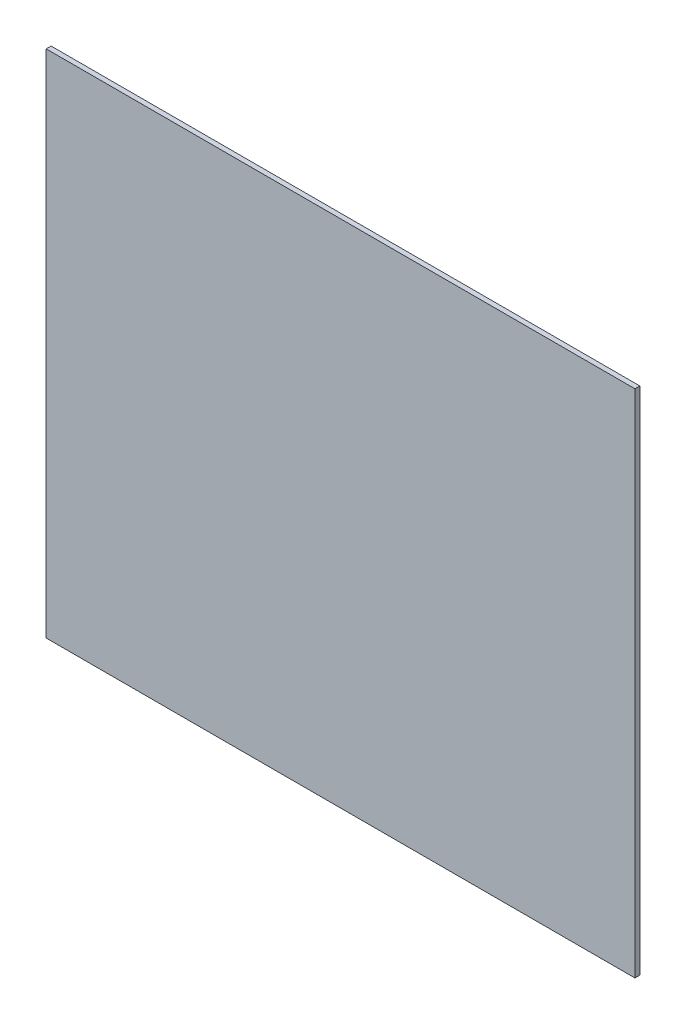
ISO-10303-21;
HEADER;
FILE_DESCRIPTION(('STEP AP214'),'2;1');
FILE_NAME('part.step','',(''),(''),'','','');
FILE_SCHEMA(('AUTOMOTIVE_DESIGN { 1 0 10303 214 1 1 1 1 }'));
ENDSEC;
DATA;
#1=APPLICATION_CONTEXT('core data for automotive mechanical design processes');
#2=APPLICATION_PROTOCOL_DEFINITION('international standard','automotive_design',2000,#1);
#3=PRODUCT_CONTEXT('',#1,'mechanical');
#4=PRODUCT('Part','Part','',(#3));
#5=PRODUCT_RELATED_PRODUCT_CATEGORY('part','',(#4));
#6=PRODUCT_DEFINITION_FORMATION('','',#4);
#7=PRODUCT_DEFINITION_CONTEXT('part definition',#1,'design');
#8=PRODUCT_DEFINITION('design','',#6,#7);
#9=PRODUCT_DEFINITION_SHAPE('','',#8);
#10=(LENGTH_UNIT() NAMED_UNIT(*) SI_UNIT(.MILLI.,.METRE.));
#11=(NAMED_UNIT(*) PLANE_ANGLE_UNIT() SI_UNIT($,.RADIAN.));
#12=(NAMED_UNIT(*) SI_UNIT($,.STERADIAN.) SOLID_ANGLE_UNIT());
#13=UNCERTAINTY_MEASURE_WITH_UNIT(LENGTH_MEASURE(1.E-05),#10,'distance_accuracy_value','');
#14=(GEOMETRIC_REPRESENTATION_CONTEXT(3) GLOBAL_UNCERTAINTY_ASSIGNED_CONTEXT((#13)) GLOBAL_UNIT_ASSIGNED_CONTEXT((#10,
#11,#12)) REPRESENTATION_CONTEXT('',''));
#15=CARTESIAN_POINT('',(0.,0.,0.));
#16=DIRECTION('',(0.,0.,1.));
#17=DIRECTION('',(1.,0.,0.));
#18=AXIS2_PLACEMENT_3D('',#15,#16,#17);
#19=CARTESIAN_POINT('',(95.2500000000001,82.55,1.5875));
#20=DIRECTION('',(-1.,0.,0.));
#21=DIRECTION('',(0.,-1.,0.));
#22=AXIS2_PLACEMENT_3D('',#19,#20,#21);
#23=PLANE('',#22);
#24=DIRECTION('',(0.,1.,0.));
#25=VECTOR('',#24,1.);
#26=CARTESIAN_POINT('',(95.2500000000001,82.55,0.));
#27=LINE('',#26,#25);
#28=CARTESIAN_POINT('',(95.2500000000001,-82.55,0.));
#29=VERTEX_POINT('',#28);
#30=CARTESIAN_POINT('',(95.2500000000001,82.55,0.));
#31=VERTEX_POINT('',#30);
#32=EDGE_CURVE('E111',#29,#31,#27,.T.);
#33=ORIENTED_EDGE('',*,*,#32,.T.);
#34=DIRECTION('',(0.,0.,-1.));
#35=VECTOR('',#34,1.);
#36=CARTESIAN_POINT('',(95.2500000000001,82.55,1.5875));
#37=LINE('',#36,#35);
#38=CARTESIAN_POINT('',(95.2500000000001,82.55,1.5875));
#39=VERTEX_POINT('',#38);
#40=EDGE_CURVE('E11',#39,#31,#37,.T.);
#41=ORIENTED_EDGE('',*,*,#40,.F.);
#42=DIRECTION('',(0.,1.,0.));
#43=VECTOR('',#42,1.);
#44=CARTESIAN_POINT('',(95.2500000000001,82.55,1.5875));
#45=LINE('',#44,#43);
#46=CARTESIAN_POINT('',(95.2500000000001,-82.55,1.5875));
#47=VERTEX_POINT('',#46);
#48=EDGE_CURVE('E100',#47,#39,#45,.T.);
#49=ORIENTED_EDGE('',*,*,#48,.F.);
#50=DIRECTION('',(0.,0.,-1.));
#51=VECTOR('',#50,1.);
#52=CARTESIAN_POINT('',(95.2500000000001,-82.55,1.5875));
#53=LINE('',#52,#51);
#54=EDGE_CURVE('E109',#47,#29,#53,.T.);
#55=ORIENTED_EDGE('',*,*,#54,.T.);
#56=EDGE_LOOP('',(#33,#41,#49,#55));
#57=FACE_BOUND('',#56,.T.);
#58=ADVANCED_FACE('F44',(#57),#23,.F.);
#59=CARTESIAN_POINT('',(-95.25,82.55,1.5875));
#60=DIRECTION('',(0.,-1.,0.));
#61=DIRECTION('',(0.,0.,-1.));
#62=AXIS2_PLACEMENT_3D('',#59,#60,#61);
#63=PLANE('',#62);
#64=DIRECTION('',(-1.,0.,0.));
#65=VECTOR('',#64,1.);
#66=CARTESIAN_POINT('',(-95.25,82.55,0.));
#67=LINE('',#66,#65);
#68=CARTESIAN_POINT('',(-95.25,82.55,0.));
#69=VERTEX_POINT('',#68);
#70=EDGE_CURVE('E105',#31,#69,#67,.T.);
#71=ORIENTED_EDGE('',*,*,#70,.T.);
#72=DIRECTION('',(0.,0.,-1.));
#73=VECTOR('',#72,1.);
#74=CARTESIAN_POINT('',(-95.25,82.55,1.5875));
#75=LINE('',#74,#73);
#76=CARTESIAN_POINT('',(-95.25,82.55,1.5875));
#77=VERTEX_POINT('',#76);
#78=EDGE_CURVE('E53',#77,#69,#75,.T.);
#79=ORIENTED_EDGE('',*,*,#78,.F.);
#80=DIRECTION('',(-1.,0.,0.));
#81=VECTOR('',#80,1.);
#82=CARTESIAN_POINT('',(-95.25,82.55,1.5875));
#83=LINE('',#82,#81);
#84=EDGE_CURVE('E95',#39,#77,#83,.T.);
#85=ORIENTED_EDGE('',*,*,#84,.F.);
#86=ORIENTED_EDGE('',*,*,#40,.T.);
#87=EDGE_LOOP('',(#71,#79,#85,#86));
#88=FACE_BOUND('',#87,.T.);
#89=ADVANCED_FACE('F102',(#88),#63,.F.);
#90=CARTESIAN_POINT('',(-95.25,82.55,1.5875));
#91=DIRECTION('',(1.,0.,0.));
#92=DIRECTION('',(0.,1.,0.));
#93=AXIS2_PLACEMENT_3D('',#90,#91,#92);
#94=PLANE('',#93);
#95=DIRECTION('',(0.,-1.,0.));
#96=VECTOR('',#95,1.);
#97=CARTESIAN_POINT('',(-95.25,82.55,0.));
#98=LINE('',#97,#96);
#99=CARTESIAN_POINT('',(-95.2499999999999,-82.55,0.));
#100=VERTEX_POINT('',#99);
#101=EDGE_CURVE('E80',#69,#100,#98,.T.);
#102=ORIENTED_EDGE('',*,*,#101,.T.);
#103=DIRECTION('',(0.,0.,-1.));
#104=VECTOR('',#103,1.);
#105=CARTESIAN_POINT('',(-95.2499999999999,-82.55,1.5875));
#106=LINE('',#105,#104);
#107=CARTESIAN_POINT('',(-95.2499999999999,-82.55,1.5875));
#108=VERTEX_POINT('',#107);
#109=EDGE_CURVE('E101',#108,#100,#106,.T.);
#110=ORIENTED_EDGE('',*,*,#109,.F.);
#111=DIRECTION('',(0.,-1.,0.));
#112=VECTOR('',#111,1.);
#113=CARTESIAN_POINT('',(-95.25,82.55,1.5875));
#114=LINE('',#113,#112);
#115=EDGE_CURVE('E94',#77,#108,#114,.T.);
#116=ORIENTED_EDGE('',*,*,#115,.F.);
#117=ORIENTED_EDGE('',*,*,#78,.T.);
#118=EDGE_LOOP('',(#102,#110,#116,#117));
#119=FACE_BOUND('',#118,.T.);
#120=ADVANCED_FACE('F103',(#119),#94,.F.);
#121=CARTESIAN_POINT('',(-95.2499999999999,-82.55,1.5875));
#122=DIRECTION('',(0.,1.,0.));
#123=DIRECTION('',(0.,0.,1.));
#124=AXIS2_PLACEMENT_3D('',#121,#122,#123);
#125=PLANE('',#124);
#126=DIRECTION('',(1.,0.,0.));
#127=VECTOR('',#126,1.);
#128=CARTESIAN_POINT('',(-95.2499999999999,-82.55,0.));
#129=LINE('',#128,#127);
#130=EDGE_CURVE('E82',#100,#29,#129,.T.);
#131=ORIENTED_EDGE('',*,*,#130,.T.);
#132=ORIENTED_EDGE('',*,*,#54,.F.);
#133=DIRECTION('',(1.,0.,0.));
#134=VECTOR('',#133,1.);
#135=CARTESIAN_POINT('',(-95.2499999999999,-82.55,1.5875));
#136=LINE('',#135,#134);
#137=EDGE_CURVE('E65',#108,#47,#136,.T.);
#138=ORIENTED_EDGE('',*,*,#137,.F.);
#139=ORIENTED_EDGE('',*,*,#109,.T.);
#140=EDGE_LOOP('',(#131,#132,#138,#139));
#141=FACE_BOUND('',#140,.T.);
#142=ADVANCED_FACE('F128',(#141),#125,.F.);
#143=CARTESIAN_POINT('',(0.,0.,1.5875));
#144=DIRECTION('',(0.,0.,1.));
#145=DIRECTION('',(1.,0.,0.));
#146=AXIS2_PLACEMENT_3D('',#143,#144,#145);
#147=PLANE('',#146);
#148=ORIENTED_EDGE('',*,*,#48,.T.);
#149=ORIENTED_EDGE('',*,*,#84,.T.);
#150=ORIENTED_EDGE('',*,*,#115,.T.);
#151=ORIENTED_EDGE('',*,*,#137,.T.);
#152=EDGE_LOOP('',(#148,#149,#150,#151));
#153=FACE_BOUND('',#152,.T.);
#154=ADVANCED_FACE('F93',(#153),#147,.T.);
#155=CARTESIAN_POINT('',(0.,0.,0.));
#156=DIRECTION('',(0.,0.,1.));
#157=DIRECTION('',(1.,0.,0.));
#158=AXIS2_PLACEMENT_3D('',#155,#156,#157);
#159=PLANE('',#158);
#160=ORIENTED_EDGE('',*,*,#32,.F.);
#161=ORIENTED_EDGE('',*,*,#130,.F.);
#162=ORIENTED_EDGE('',*,*,#101,.F.);
#163=ORIENTED_EDGE('',*,*,#70,.F.);
#164=EDGE_LOOP('',(#160,#161,#162,#163));
#165=FACE_BOUND('',#164,.T.);
#166=ADVANCED_FACE('F129',(#165),#159,.F.);
#167=CLOSED_SHELL('',(#58,#89,#120,#142,#154,#166));
#168=MANIFOLD_SOLID_BREP('B2',#167);
#169=ADVANCED_BREP_SHAPE_REPRESENTATION('',(#18,#168),#14);
#170=SHAPE_DEFINITION_REPRESENTATION(#9,#169);
ENDSEC;
END-ISO-10303-21;
